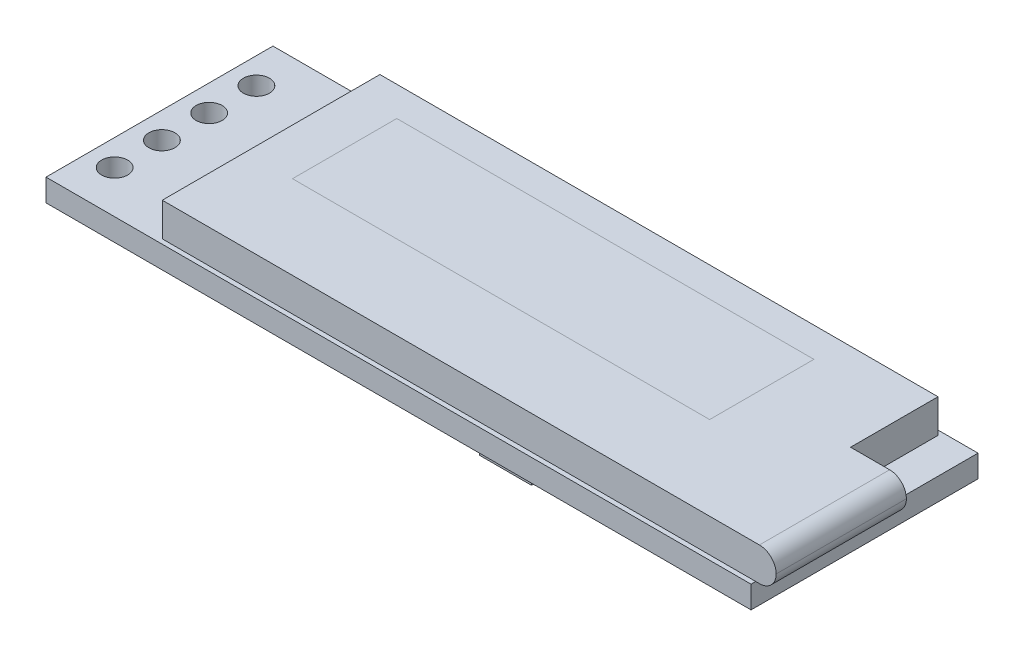
ISO-10303-21;
HEADER;
FILE_DESCRIPTION(('STEP AP214'),'2;1');
FILE_NAME('part.step','',(''),(''),'','','');
FILE_SCHEMA(('AUTOMOTIVE_DESIGN { 1 0 10303 214 1 1 1 1 }'));
ENDSEC;
DATA;
#1=APPLICATION_CONTEXT('core data for automotive mechanical design processes');
#2=APPLICATION_PROTOCOL_DEFINITION('international standard','automotive_design',2000,#1);
#3=PRODUCT_CONTEXT('',#1,'mechanical');
#4=PRODUCT('Part','Part','',(#3));
#5=PRODUCT_RELATED_PRODUCT_CATEGORY('part','',(#4));
#6=PRODUCT_DEFINITION_FORMATION('','',#4);
#7=PRODUCT_DEFINITION_CONTEXT('part definition',#1,'design');
#8=PRODUCT_DEFINITION('design','',#6,#7);
#9=PRODUCT_DEFINITION_SHAPE('','',#8);
#10=(LENGTH_UNIT() NAMED_UNIT(*) SI_UNIT(.MILLI.,.METRE.));
#11=(NAMED_UNIT(*) PLANE_ANGLE_UNIT() SI_UNIT($,.RADIAN.));
#12=(NAMED_UNIT(*) SI_UNIT($,.STERADIAN.) SOLID_ANGLE_UNIT());
#13=UNCERTAINTY_MEASURE_WITH_UNIT(LENGTH_MEASURE(1.E-05),#10,'distance_accuracy_value','');
#14=(GEOMETRIC_REPRESENTATION_CONTEXT(3) GLOBAL_UNCERTAINTY_ASSIGNED_CONTEXT((#13)) GLOBAL_UNIT_ASSIGNED_CONTEXT((#10,
#11,#12)) REPRESENTATION_CONTEXT('',''));
#15=CARTESIAN_POINT('',(0.,0.,0.));
#16=DIRECTION('',(0.,0.,1.));
#17=DIRECTION('',(1.,0.,0.));
#18=AXIS2_PLACEMENT_3D('',#15,#16,#17);
#19=CARTESIAN_POINT('',(0.,0.,0.));
#20=DIRECTION('',(0.,1.,0.));
#21=DIRECTION('',(0.,0.,1.));
#22=AXIS2_PLACEMENT_3D('',#19,#20,#21);
#23=PLANE('',#22);
#24=DIRECTION('',(0.,0.,1.));
#25=VECTOR('',#24,1.);
#26=CARTESIAN_POINT('',(-0.650000000000002,0.,4.7));
#27=LINE('',#26,#25);
#28=CARTESIAN_POINT('',(-0.65,0.,-3.3));
#29=VERTEX_POINT('',#28);
#30=CARTESIAN_POINT('',(-0.650000000000002,0.,4.7));
#31=VERTEX_POINT('',#30);
#32=EDGE_CURVE('E232',#29,#31,#27,.T.);
#33=ORIENTED_EDGE('',*,*,#32,.F.);
#34=DIRECTION('',(1.,0.,0.));
#35=VECTOR('',#34,1.);
#36=CARTESIAN_POINT('',(-3.45,0.,-3.3));
#37=LINE('',#36,#35);
#38=CARTESIAN_POINT('',(-3.45,0.,-3.3));
#39=VERTEX_POINT('',#38);
#40=EDGE_CURVE('E245',#39,#29,#37,.T.);
#41=ORIENTED_EDGE('',*,*,#40,.F.);
#42=DIRECTION('',(0.,0.,-1.));
#43=VECTOR('',#42,1.);
#44=CARTESIAN_POINT('',(-3.45,0.,4.7));
#45=LINE('',#44,#43);
#46=CARTESIAN_POINT('',(-3.45,0.,4.7));
#47=VERTEX_POINT('',#46);
#48=EDGE_CURVE('E254',#47,#39,#45,.T.);
#49=ORIENTED_EDGE('',*,*,#48,.F.);
#50=DIRECTION('',(-1.,0.,0.));
#51=VECTOR('',#50,1.);
#52=CARTESIAN_POINT('',(-3.45,0.,4.7));
#53=LINE('',#52,#51);
#54=EDGE_CURVE('E235',#31,#47,#53,.T.);
#55=ORIENTED_EDGE('',*,*,#54,.F.);
#56=EDGE_LOOP('',(#33,#41,#49,#55));
#57=FACE_BOUND('',#56,.T.);
#58=DIRECTION('',(0.,0.,-1.));
#59=VECTOR('',#58,1.);
#60=CARTESIAN_POINT('',(18.95,0.,-6.1));
#61=LINE('',#60,#59);
#62=CARTESIAN_POINT('',(18.95,0.,6.1));
#63=VERTEX_POINT('',#62);
#64=CARTESIAN_POINT('',(18.95,0.,-6.1));
#65=VERTEX_POINT('',#64);
#66=EDGE_CURVE('E368',#63,#65,#61,.T.);
#67=ORIENTED_EDGE('',*,*,#66,.F.);
#68=DIRECTION('',(1.,0.,0.));
#69=VECTOR('',#68,1.);
#70=CARTESIAN_POINT('',(-18.95,0.,6.1));
#71=LINE('',#70,#69);
#72=CARTESIAN_POINT('',(-18.95,0.,6.1));
#73=VERTEX_POINT('',#72);
#74=EDGE_CURVE('E387',#73,#63,#71,.T.);
#75=ORIENTED_EDGE('',*,*,#74,.F.);
#76=DIRECTION('',(0.,0.,1.));
#77=VECTOR('',#76,1.);
#78=CARTESIAN_POINT('',(-18.95,0.,-6.1));
#79=LINE('',#78,#77);
#80=CARTESIAN_POINT('',(-18.95,0.,-6.1));
#81=VERTEX_POINT('',#80);
#82=EDGE_CURVE('E385',#81,#73,#79,.T.);
#83=ORIENTED_EDGE('',*,*,#82,.F.);
#84=DIRECTION('',(-1.,0.,0.));
#85=VECTOR('',#84,1.);
#86=CARTESIAN_POINT('',(-18.95,0.,-6.1));
#87=LINE('',#86,#85);
#88=EDGE_CURVE('E383',#65,#81,#87,.T.);
#89=ORIENTED_EDGE('',*,*,#88,.F.);
#90=EDGE_LOOP('',(#67,#75,#83,#89));
#91=FACE_BOUND('',#90,.T.);
#92=CARTESIAN_POINT('',(-17.5499999999999,0.,3.81));
#93=DIRECTION('',(0.,1.,0.));
#94=DIRECTION('',(0.,0.,1.));
#95=AXIS2_PLACEMENT_3D('',#92,#93,#94);
#96=CIRCLE('',#95,0.699999999999998);
#97=CARTESIAN_POINT('',(-17.5499999999999,0.,4.51));
#98=VERTEX_POINT('',#97);
#99=EDGE_CURVE('E323',#98,#98,#96,.T.);
#100=ORIENTED_EDGE('',*,*,#99,.T.);
#101=EDGE_LOOP('',(#100));
#102=FACE_BOUND('',#101,.T.);
#103=CARTESIAN_POINT('',(-17.55,0.,1.27));
#104=DIRECTION('',(0.,1.,0.));
#105=DIRECTION('',(0.,0.,1.));
#106=AXIS2_PLACEMENT_3D('',#103,#104,#105);
#107=CIRCLE('',#106,0.699999999999998);
#108=CARTESIAN_POINT('',(-17.55,0.,1.97));
#109=VERTEX_POINT('',#108);
#110=EDGE_CURVE('E317',#109,#109,#107,.T.);
#111=ORIENTED_EDGE('',*,*,#110,.T.);
#112=EDGE_LOOP('',(#111));
#113=FACE_BOUND('',#112,.T.);
#114=CARTESIAN_POINT('',(-17.55,0.,-1.27));
#115=DIRECTION('',(0.,1.,0.));
#116=DIRECTION('',(0.,0.,1.));
#117=AXIS2_PLACEMENT_3D('',#114,#115,#116);
#118=CIRCLE('',#117,0.699999999999998);
#119=CARTESIAN_POINT('',(-17.55,0.,-0.570000000000002));
#120=VERTEX_POINT('',#119);
#121=EDGE_CURVE('E311',#120,#120,#118,.T.);
#122=ORIENTED_EDGE('',*,*,#121,.T.);
#123=EDGE_LOOP('',(#122));
#124=FACE_BOUND('',#123,.T.);
#125=CARTESIAN_POINT('',(-17.55,0.,-3.81));
#126=DIRECTION('',(0.,1.,0.));
#127=DIRECTION('',(0.,0.,1.));
#128=AXIS2_PLACEMENT_3D('',#125,#126,#127);
#129=CIRCLE('',#128,0.699999999999998);
#130=CARTESIAN_POINT('',(-17.55,0.,-3.11));
#131=VERTEX_POINT('',#130);
#132=EDGE_CURVE('E304',#131,#131,#129,.T.);
#133=ORIENTED_EDGE('',*,*,#132,.T.);
#134=EDGE_LOOP('',(#133));
#135=FACE_BOUND('',#134,.T.);
#136=DIRECTION('',(0.,0.,1.));
#137=VECTOR('',#136,1.);
#138=CARTESIAN_POINT('',(6.44999999999999,0.,5.4));
#139=LINE('',#138,#137);
#140=CARTESIAN_POINT('',(6.44999999999999,0.,-4.7));
#141=VERTEX_POINT('',#140);
#142=CARTESIAN_POINT('',(6.44999999999999,0.,5.4));
#143=VERTEX_POINT('',#142);
#144=EDGE_CURVE('E270',#141,#143,#139,.T.);
#145=ORIENTED_EDGE('',*,*,#144,.F.);
#146=DIRECTION('',(1.,0.,0.));
#147=VECTOR('',#146,1.);
#148=CARTESIAN_POINT('',(3.65,0.,-4.7));
#149=LINE('',#148,#147);
#150=CARTESIAN_POINT('',(3.65,0.,-4.7));
#151=VERTEX_POINT('',#150);
#152=EDGE_CURVE('E275',#151,#141,#149,.T.);
#153=ORIENTED_EDGE('',*,*,#152,.F.);
#154=DIRECTION('',(0.,0.,-1.));
#155=VECTOR('',#154,1.);
#156=CARTESIAN_POINT('',(3.64999999999999,0.,5.4));
#157=LINE('',#156,#155);
#158=CARTESIAN_POINT('',(3.64999999999999,0.,5.4));
#159=VERTEX_POINT('',#158);
#160=EDGE_CURVE('E287',#159,#151,#157,.T.);
#161=ORIENTED_EDGE('',*,*,#160,.F.);
#162=DIRECTION('',(-1.,0.,0.));
#163=VECTOR('',#162,1.);
#164=CARTESIAN_POINT('',(3.64999999999999,0.,5.4));
#165=LINE('',#164,#163);
#166=EDGE_CURVE('E284',#143,#159,#165,.T.);
#167=ORIENTED_EDGE('',*,*,#166,.F.);
#168=EDGE_LOOP('',(#145,#153,#161,#167));
#169=FACE_BOUND('',#168,.T.);
#170=DIRECTION('',(0.,0.,1.));
#171=VECTOR('',#170,1.);
#172=CARTESIAN_POINT('',(-7.55,0.,4.3));
#173=LINE('',#172,#171);
#174=CARTESIAN_POINT('',(-7.55,0.,-3.1));
#175=VERTEX_POINT('',#174);
#176=CARTESIAN_POINT('',(-7.55,0.,4.3));
#177=VERTEX_POINT('',#176);
#178=EDGE_CURVE('E231',#175,#177,#173,.T.);
#179=ORIENTED_EDGE('',*,*,#178,.F.);
#180=DIRECTION('',(1.,0.,0.));
#181=VECTOR('',#180,1.);
#182=CARTESIAN_POINT('',(-11.55,0.,-3.1));
#183=LINE('',#182,#181);
#184=CARTESIAN_POINT('',(-11.55,0.,-3.1));
#185=VERTEX_POINT('',#184);
#186=EDGE_CURVE('E228',#185,#175,#183,.T.);
#187=ORIENTED_EDGE('',*,*,#186,.F.);
#188=DIRECTION('',(0.,0.,-1.));
#189=VECTOR('',#188,1.);
#190=CARTESIAN_POINT('',(-11.55,0.,4.3));
#191=LINE('',#190,#189);
#192=CARTESIAN_POINT('',(-11.55,0.,4.3));
#193=VERTEX_POINT('',#192);
#194=EDGE_CURVE('E59',#193,#185,#191,.T.);
#195=ORIENTED_EDGE('',*,*,#194,.F.);
#196=DIRECTION('',(-1.,0.,0.));
#197=VECTOR('',#196,1.);
#198=CARTESIAN_POINT('',(-11.55,0.,4.3));
#199=LINE('',#198,#197);
#200=EDGE_CURVE('E54',#177,#193,#199,.T.);
#201=ORIENTED_EDGE('',*,*,#200,.F.);
#202=EDGE_LOOP('',(#179,#187,#195,#201));
#203=FACE_BOUND('',#202,.T.);
#204=ADVANCED_FACE('F38',(#57,#91,#102,#113,#124,#135,#169,#203),#23,.F.);
#205=CARTESIAN_POINT('',(0.,3.,0.));
#206=DIRECTION('',(0.,1.,0.));
#207=DIRECTION('',(0.,0.,1.));
#208=AXIS2_PLACEMENT_3D('',#205,#206,#207);
#209=PLANE('',#208);
#210=DIRECTION('',(1.,0.,0.));
#211=VECTOR('',#210,1.);
#212=CARTESIAN_POINT('',(17.05,3.,5.85));
#213=LINE('',#212,#211);
#214=CARTESIAN_POINT('',(-12.95,3.,5.85));
#215=VERTEX_POINT('',#214);
#216=CARTESIAN_POINT('',(19.15,3.,5.85));
#217=VERTEX_POINT('',#216);
#218=EDGE_CURVE('E328',#215,#217,#213,.T.);
#219=ORIENTED_EDGE('',*,*,#218,.T.);
#220=DIRECTION('',(0.,0.,-1.));
#221=VECTOR('',#220,1.);
#222=CARTESIAN_POINT('',(19.15,3.,-1.15));
#223=LINE('',#222,#221);
#224=CARTESIAN_POINT('',(19.15,3.,-1.15));
#225=VERTEX_POINT('',#224);
#226=EDGE_CURVE('E411',#217,#225,#223,.T.);
#227=ORIENTED_EDGE('',*,*,#226,.T.);
#228=DIRECTION('',(-1.,0.,0.));
#229=VECTOR('',#228,1.);
#230=CARTESIAN_POINT('',(17.05,3.,-1.15));
#231=LINE('',#230,#229);
#232=CARTESIAN_POINT('',(17.05,3.,-1.15));
#233=VERTEX_POINT('',#232);
#234=EDGE_CURVE('E331',#225,#233,#231,.T.);
#235=ORIENTED_EDGE('',*,*,#234,.T.);
#236=DIRECTION('',(0.,0.,-1.));
#237=VECTOR('',#236,1.);
#238=CARTESIAN_POINT('',(17.05,3.,-5.85));
#239=LINE('',#238,#237);
#240=CARTESIAN_POINT('',(17.05,3.,-5.85));
#241=VERTEX_POINT('',#240);
#242=EDGE_CURVE('E334',#233,#241,#239,.T.);
#243=ORIENTED_EDGE('',*,*,#242,.T.);
#244=DIRECTION('',(-1.,0.,0.));
#245=VECTOR('',#244,1.);
#246=CARTESIAN_POINT('',(-12.95,3.,-5.85));
#247=LINE('',#246,#245);
#248=CARTESIAN_POINT('',(-12.95,3.,-5.85));
#249=VERTEX_POINT('',#248);
#250=EDGE_CURVE('E336',#241,#249,#247,.T.);
#251=ORIENTED_EDGE('',*,*,#250,.T.);
#252=DIRECTION('',(0.,0.,1.));
#253=VECTOR('',#252,1.);
#254=CARTESIAN_POINT('',(-12.95,3.,-5.85));
#255=LINE('',#254,#253);
#256=EDGE_CURVE('E338',#249,#215,#255,.T.);
#257=ORIENTED_EDGE('',*,*,#256,.T.);
#258=EDGE_LOOP('',(#219,#227,#235,#243,#251,#257));
#259=FACE_BOUND('',#258,.T.);
#260=DIRECTION('',(1.,0.,0.));
#261=VECTOR('',#260,1.);
#262=CARTESIAN_POINT('',(0.,3.,-4.2559684370898));
#263=LINE('',#262,#261);
#264=CARTESIAN_POINT('',(-10.45,3.,-4.2559684370898));
#265=VERTEX_POINT('',#264);
#266=CARTESIAN_POINT('',(11.9738737483592,3.,-4.2559684370898));
#267=VERTEX_POINT('',#266);
#268=EDGE_CURVE('E47',#265,#267,#263,.T.);
#269=ORIENTED_EDGE('',*,*,#268,.T.);
#270=DIRECTION('',(0.,0.,1.));
#271=VECTOR('',#270,1.);
#272=CARTESIAN_POINT('',(11.9738737483592,3.,0.));
#273=LINE('',#272,#271);
#274=CARTESIAN_POINT('',(11.9738737483592,3.,1.35));
#275=VERTEX_POINT('',#274);
#276=EDGE_CURVE('E11',#267,#275,#273,.T.);
#277=ORIENTED_EDGE('',*,*,#276,.T.);
#278=DIRECTION('',(-1.,0.,0.));
#279=VECTOR('',#278,1.);
#280=CARTESIAN_POINT('',(0.,3.,1.35));
#281=LINE('',#280,#279);
#282=CARTESIAN_POINT('',(-10.45,3.,1.35));
#283=VERTEX_POINT('',#282);
#284=EDGE_CURVE('E413',#275,#283,#281,.T.);
#285=ORIENTED_EDGE('',*,*,#284,.T.);
#286=DIRECTION('',(0.,0.,-1.));
#287=VECTOR('',#286,1.);
#288=CARTESIAN_POINT('',(-10.45,3.,0.));
#289=LINE('',#288,#287);
#290=EDGE_CURVE('E419',#283,#265,#289,.T.);
#291=ORIENTED_EDGE('',*,*,#290,.T.);
#292=EDGE_LOOP('',(#269,#277,#285,#291));
#293=FACE_BOUND('',#292,.T.);
#294=ADVANCED_FACE('F427',(#259,#293),#209,.T.);
#295=CARTESIAN_POINT('',(18.95,1.2,-6.1));
#296=DIRECTION('',(-1.,0.,0.));
#297=DIRECTION('',(0.,0.,1.));
#298=AXIS2_PLACEMENT_3D('',#295,#296,#297);
#299=PLANE('',#298);
#300=ORIENTED_EDGE('',*,*,#66,.T.);
#301=DIRECTION('',(0.,-1.,0.));
#302=VECTOR('',#301,1.);
#303=CARTESIAN_POINT('',(18.95,1.2,-6.1));
#304=LINE('',#303,#302);
#305=CARTESIAN_POINT('',(18.95,1.2,-6.1));
#306=VERTEX_POINT('',#305);
#307=EDGE_CURVE('E397',#306,#65,#304,.T.);
#308=ORIENTED_EDGE('',*,*,#307,.F.);
#309=DIRECTION('',(0.,0.,-1.));
#310=VECTOR('',#309,1.);
#311=CARTESIAN_POINT('',(18.95,1.2,-6.1));
#312=LINE('',#311,#310);
#313=CARTESIAN_POINT('',(18.95,1.2,-1.15));
#314=VERTEX_POINT('',#313);
#315=EDGE_CURVE('E374',#314,#306,#312,.T.);
#316=ORIENTED_EDGE('',*,*,#315,.F.);
#317=CARTESIAN_POINT('',(18.95,1.2,5.85));
#318=VERTEX_POINT('',#317);
#319=EDGE_CURVE('E373',#318,#314,#312,.T.);
#320=ORIENTED_EDGE('',*,*,#319,.F.);
#321=CARTESIAN_POINT('',(18.95,1.2,6.1));
#322=VERTEX_POINT('',#321);
#323=EDGE_CURVE('E369',#322,#318,#312,.T.);
#324=ORIENTED_EDGE('',*,*,#323,.F.);
#325=DIRECTION('',(0.,-1.,0.));
#326=VECTOR('',#325,1.);
#327=CARTESIAN_POINT('',(18.95,1.2,6.1));
#328=LINE('',#327,#326);
#329=EDGE_CURVE('E380',#322,#63,#328,.T.);
#330=ORIENTED_EDGE('',*,*,#329,.T.);
#331=EDGE_LOOP('',(#300,#308,#316,#320,#324,#330));
#332=FACE_BOUND('',#331,.T.);
#333=ADVANCED_FACE('F446',(#332),#299,.F.);
#334=CARTESIAN_POINT('',(-18.95,1.2,-6.1));
#335=DIRECTION('',(0.,0.,1.));
#336=DIRECTION('',(1.,0.,0.));
#337=AXIS2_PLACEMENT_3D('',#334,#335,#336);
#338=PLANE('',#337);
#339=ORIENTED_EDGE('',*,*,#88,.T.);
#340=DIRECTION('',(0.,-1.,0.));
#341=VECTOR('',#340,1.);
#342=CARTESIAN_POINT('',(-18.95,1.2,-6.1));
#343=LINE('',#342,#341);
#344=CARTESIAN_POINT('',(-18.95,1.2,-6.1));
#345=VERTEX_POINT('',#344);
#346=EDGE_CURVE('E394',#345,#81,#343,.T.);
#347=ORIENTED_EDGE('',*,*,#346,.F.);
#348=DIRECTION('',(-1.,0.,0.));
#349=VECTOR('',#348,1.);
#350=CARTESIAN_POINT('',(-18.95,1.2,-6.1));
#351=LINE('',#350,#349);
#352=EDGE_CURVE('E372',#306,#345,#351,.T.);
#353=ORIENTED_EDGE('',*,*,#352,.F.);
#354=ORIENTED_EDGE('',*,*,#307,.T.);
#355=EDGE_LOOP('',(#339,#347,#353,#354));
#356=FACE_BOUND('',#355,.T.);
#357=ADVANCED_FACE('F465',(#356),#338,.F.);
#358=CARTESIAN_POINT('',(-18.95,1.2,-6.1));
#359=DIRECTION('',(1.,0.,0.));
#360=DIRECTION('',(0.,0.,-1.));
#361=AXIS2_PLACEMENT_3D('',#358,#359,#360);
#362=PLANE('',#361);
#363=ORIENTED_EDGE('',*,*,#82,.T.);
#364=DIRECTION('',(0.,-1.,0.));
#365=VECTOR('',#364,1.);
#366=CARTESIAN_POINT('',(-18.95,1.2,6.1));
#367=LINE('',#366,#365);
#368=CARTESIAN_POINT('',(-18.95,1.2,6.1));
#369=VERTEX_POINT('',#368);
#370=EDGE_CURVE('E391',#369,#73,#367,.T.);
#371=ORIENTED_EDGE('',*,*,#370,.F.);
#372=DIRECTION('',(0.,0.,1.));
#373=VECTOR('',#372,1.);
#374=CARTESIAN_POINT('',(-18.95,1.2,-6.1));
#375=LINE('',#374,#373);
#376=EDGE_CURVE('E376',#345,#369,#375,.T.);
#377=ORIENTED_EDGE('',*,*,#376,.F.);
#378=ORIENTED_EDGE('',*,*,#346,.T.);
#379=EDGE_LOOP('',(#363,#371,#377,#378));
#380=FACE_BOUND('',#379,.T.);
#381=ADVANCED_FACE('F461',(#380),#362,.F.);
#382=CARTESIAN_POINT('',(-18.95,1.2,6.1));
#383=DIRECTION('',(0.,0.,-1.));
#384=DIRECTION('',(-1.,0.,0.));
#385=AXIS2_PLACEMENT_3D('',#382,#383,#384);
#386=PLANE('',#385);
#387=ORIENTED_EDGE('',*,*,#74,.T.);
#388=ORIENTED_EDGE('',*,*,#329,.F.);
#389=DIRECTION('',(1.,0.,0.));
#390=VECTOR('',#389,1.);
#391=CARTESIAN_POINT('',(-18.95,1.2,6.1));
#392=LINE('',#391,#390);
#393=EDGE_CURVE('E378',#369,#322,#392,.T.);
#394=ORIENTED_EDGE('',*,*,#393,.F.);
#395=ORIENTED_EDGE('',*,*,#370,.T.);
#396=EDGE_LOOP('',(#387,#388,#394,#395));
#397=FACE_BOUND('',#396,.T.);
#398=ADVANCED_FACE('F458',(#397),#386,.F.);
#399=CARTESIAN_POINT('',(0.,1.2,0.));
#400=DIRECTION('',(0.,1.,0.));
#401=DIRECTION('',(0.,0.,1.));
#402=AXIS2_PLACEMENT_3D('',#399,#400,#401);
#403=PLANE('',#402);
#404=CARTESIAN_POINT('',(-17.55,1.2,-3.81));
#405=DIRECTION('',(0.,1.,0.));
#406=DIRECTION('',(0.,0.,1.));
#407=AXIS2_PLACEMENT_3D('',#404,#405,#406);
#408=CIRCLE('',#407,0.699999999999998);
#409=CARTESIAN_POINT('',(-17.55,1.2,-3.11));
#410=VERTEX_POINT('',#409);
#411=EDGE_CURVE('E308',#410,#410,#408,.T.);
#412=ORIENTED_EDGE('',*,*,#411,.F.);
#413=EDGE_LOOP('',(#412));
#414=FACE_BOUND('',#413,.T.);
#415=CARTESIAN_POINT('',(-17.55,1.2,-1.27));
#416=DIRECTION('',(0.,1.,0.));
#417=DIRECTION('',(0.,0.,1.));
#418=AXIS2_PLACEMENT_3D('',#415,#416,#417);
#419=CIRCLE('',#418,0.699999999999998);
#420=CARTESIAN_POINT('',(-17.55,1.2,-0.570000000000002));
#421=VERTEX_POINT('',#420);
#422=EDGE_CURVE('E314',#421,#421,#419,.T.);
#423=ORIENTED_EDGE('',*,*,#422,.F.);
#424=EDGE_LOOP('',(#423));
#425=FACE_BOUND('',#424,.T.);
#426=CARTESIAN_POINT('',(-17.55,1.2,1.27));
#427=DIRECTION('',(0.,1.,0.));
#428=DIRECTION('',(0.,0.,1.));
#429=AXIS2_PLACEMENT_3D('',#426,#427,#428);
#430=CIRCLE('',#429,0.699999999999998);
#431=CARTESIAN_POINT('',(-17.55,1.2,1.97));
#432=VERTEX_POINT('',#431);
#433=EDGE_CURVE('E320',#432,#432,#430,.T.);
#434=ORIENTED_EDGE('',*,*,#433,.F.);
#435=EDGE_LOOP('',(#434));
#436=FACE_BOUND('',#435,.T.);
#437=CARTESIAN_POINT('',(-17.5499999999999,1.2,3.81));
#438=DIRECTION('',(0.,1.,0.));
#439=DIRECTION('',(0.,0.,1.));
#440=AXIS2_PLACEMENT_3D('',#437,#438,#439);
#441=CIRCLE('',#440,0.699999999999998);
#442=CARTESIAN_POINT('',(-17.5499999999999,1.2,4.51));
#443=VERTEX_POINT('',#442);
#444=EDGE_CURVE('E303',#443,#443,#441,.T.);
#445=ORIENTED_EDGE('',*,*,#444,.F.);
#446=EDGE_LOOP('',(#445));
#447=FACE_BOUND('',#446,.T.);
#448=DIRECTION('',(1.,0.,0.));
#449=VECTOR('',#448,1.);
#450=CARTESIAN_POINT('',(-12.95,1.2,5.85));
#451=LINE('',#450,#449);
#452=CARTESIAN_POINT('',(-12.95,1.2,5.85));
#453=VERTEX_POINT('',#452);
#454=EDGE_CURVE('E332',#453,#318,#451,.T.);
#455=ORIENTED_EDGE('',*,*,#454,.F.);
#456=DIRECTION('',(0.,0.,1.));
#457=VECTOR('',#456,1.);
#458=CARTESIAN_POINT('',(-12.95,1.2,-5.85));
#459=LINE('',#458,#457);
#460=CARTESIAN_POINT('',(-12.95,1.2,-5.85));
#461=VERTEX_POINT('',#460);
#462=EDGE_CURVE('E351',#461,#453,#459,.T.);
#463=ORIENTED_EDGE('',*,*,#462,.F.);
#464=DIRECTION('',(-1.,0.,0.));
#465=VECTOR('',#464,1.);
#466=CARTESIAN_POINT('',(-12.95,1.2,-5.85));
#467=LINE('',#466,#465);
#468=CARTESIAN_POINT('',(17.05,1.2,-5.85));
#469=VERTEX_POINT('',#468);
#470=EDGE_CURVE('E348',#469,#461,#467,.T.);
#471=ORIENTED_EDGE('',*,*,#470,.F.);
#472=DIRECTION('',(0.,0.,-1.));
#473=VECTOR('',#472,1.);
#474=CARTESIAN_POINT('',(17.05,1.2,-5.85));
#475=LINE('',#474,#473);
#476=CARTESIAN_POINT('',(17.05,1.2,-1.15));
#477=VERTEX_POINT('',#476);
#478=EDGE_CURVE('E344',#477,#469,#475,.T.);
#479=ORIENTED_EDGE('',*,*,#478,.F.);
#480=DIRECTION('',(-1.,0.,0.));
#481=VECTOR('',#480,1.);
#482=CARTESIAN_POINT('',(17.05,1.2,-1.15));
#483=LINE('',#482,#481);
#484=EDGE_CURVE('E345',#314,#477,#483,.T.);
#485=ORIENTED_EDGE('',*,*,#484,.F.);
#486=ORIENTED_EDGE('',*,*,#315,.T.);
#487=ORIENTED_EDGE('',*,*,#352,.T.);
#488=ORIENTED_EDGE('',*,*,#376,.T.);
#489=ORIENTED_EDGE('',*,*,#393,.T.);
#490=ORIENTED_EDGE('',*,*,#323,.T.);
#491=EDGE_LOOP('',(#455,#463,#471,#479,#485,#486,#487,#488,#489,#490));
#492=FACE_BOUND('',#491,.T.);
#493=ADVANCED_FACE('F456',(#414,#425,#436,#447,#492),#403,.T.);
#494=CARTESIAN_POINT('',(0.,1.2,0.));
#495=DIRECTION('',(0.,1.,0.));
#496=DIRECTION('',(0.,0.,1.));
#497=AXIS2_PLACEMENT_3D('',#494,#495,#496);
#498=PLANE('',#497);
#499=CARTESIAN_POINT('',(19.15,1.2,-1.15));
#500=VERTEX_POINT('',#499);
#501=EDGE_CURVE('E342',#500,#314,#483,.T.);
#502=ORIENTED_EDGE('',*,*,#501,.F.);
#503=DIRECTION('',(0.,0.,-1.));
#504=VECTOR('',#503,1.);
#505=CARTESIAN_POINT('',(19.15,1.2,0.));
#506=LINE('',#505,#504);
#507=CARTESIAN_POINT('',(19.15,1.2,5.85));
#508=VERTEX_POINT('',#507);
#509=EDGE_CURVE('E404',#500,#508,#506,.F.);
#510=ORIENTED_EDGE('',*,*,#509,.T.);
#511=EDGE_CURVE('E354',#318,#508,#451,.T.);
#512=ORIENTED_EDGE('',*,*,#511,.F.);
#513=ORIENTED_EDGE('',*,*,#319,.T.);
#514=EDGE_LOOP('',(#502,#510,#512,#513));
#515=FACE_BOUND('',#514,.T.);
#516=ADVANCED_FACE('F488',(#515),#498,.F.);
#517=CARTESIAN_POINT('',(17.05,3.,-1.15));
#518=DIRECTION('',(0.,0.,1.));
#519=DIRECTION('',(1.,0.,0.));
#520=AXIS2_PLACEMENT_3D('',#517,#518,#519);
#521=PLANE('',#520);
#522=CARTESIAN_POINT('',(19.15,2.1,-1.15));
#523=DIRECTION('',(0.,0.,1.));
#524=DIRECTION('',(1.,0.,0.));
#525=AXIS2_PLACEMENT_3D('',#522,#523,#524);
#526=CIRCLE('',#525,0.9);
#527=CARTESIAN_POINT('',(20.05,2.1,-1.15));
#528=VERTEX_POINT('',#527);
#529=EDGE_CURVE('E400',#225,#528,#526,.F.);
#530=ORIENTED_EDGE('',*,*,#529,.T.);
#531=CARTESIAN_POINT('',(19.15,2.1,-1.15));
#532=DIRECTION('',(0.,0.,1.));
#533=DIRECTION('',(1.,0.,0.));
#534=AXIS2_PLACEMENT_3D('',#531,#532,#533);
#535=CIRCLE('',#534,0.9);
#536=EDGE_CURVE('E402',#528,#500,#535,.F.);
#537=ORIENTED_EDGE('',*,*,#536,.T.);
#538=ORIENTED_EDGE('',*,*,#501,.T.);
#539=ORIENTED_EDGE('',*,*,#484,.T.);
#540=DIRECTION('',(0.,-1.,0.));
#541=VECTOR('',#540,1.);
#542=CARTESIAN_POINT('',(17.05,3.,-1.15));
#543=LINE('',#542,#541);
#544=EDGE_CURVE('E365',#233,#477,#543,.T.);
#545=ORIENTED_EDGE('',*,*,#544,.F.);
#546=ORIENTED_EDGE('',*,*,#234,.F.);
#547=EDGE_LOOP('',(#530,#537,#538,#539,#545,#546));
#548=FACE_BOUND('',#547,.T.);
#549=ADVANCED_FACE('F508',(#548),#521,.F.);
#550=CARTESIAN_POINT('',(17.05,3.,-5.85));
#551=DIRECTION('',(-1.,0.,0.));
#552=DIRECTION('',(0.,0.,1.));
#553=AXIS2_PLACEMENT_3D('',#550,#551,#552);
#554=PLANE('',#553);
#555=ORIENTED_EDGE('',*,*,#478,.T.);
#556=DIRECTION('',(0.,-1.,0.));
#557=VECTOR('',#556,1.);
#558=CARTESIAN_POINT('',(17.05,3.,-5.85));
#559=LINE('',#558,#557);
#560=EDGE_CURVE('E362',#241,#469,#559,.T.);
#561=ORIENTED_EDGE('',*,*,#560,.F.);
#562=ORIENTED_EDGE('',*,*,#242,.F.);
#563=ORIENTED_EDGE('',*,*,#544,.T.);
#564=EDGE_LOOP('',(#555,#561,#562,#563));
#565=FACE_BOUND('',#564,.T.);
#566=ADVANCED_FACE('F503',(#565),#554,.F.);
#567=CARTESIAN_POINT('',(-12.95,3.,-5.85));
#568=DIRECTION('',(0.,0.,1.));
#569=DIRECTION('',(1.,0.,0.));
#570=AXIS2_PLACEMENT_3D('',#567,#568,#569);
#571=PLANE('',#570);
#572=ORIENTED_EDGE('',*,*,#470,.T.);
#573=DIRECTION('',(0.,-1.,0.));
#574=VECTOR('',#573,1.);
#575=CARTESIAN_POINT('',(-12.95,3.,-5.85));
#576=LINE('',#575,#574);
#577=EDGE_CURVE('E359',#249,#461,#576,.T.);
#578=ORIENTED_EDGE('',*,*,#577,.F.);
#579=ORIENTED_EDGE('',*,*,#250,.F.);
#580=ORIENTED_EDGE('',*,*,#560,.T.);
#581=EDGE_LOOP('',(#572,#578,#579,#580));
#582=FACE_BOUND('',#581,.T.);
#583=ADVANCED_FACE('F498',(#582),#571,.F.);
#584=CARTESIAN_POINT('',(-12.95,3.,-5.85));
#585=DIRECTION('',(1.,0.,0.));
#586=DIRECTION('',(0.,0.,-1.));
#587=AXIS2_PLACEMENT_3D('',#584,#585,#586);
#588=PLANE('',#587);
#589=ORIENTED_EDGE('',*,*,#462,.T.);
#590=DIRECTION('',(0.,-1.,0.));
#591=VECTOR('',#590,1.);
#592=CARTESIAN_POINT('',(-12.95,3.,5.85));
#593=LINE('',#592,#591);
#594=EDGE_CURVE('E341',#215,#453,#593,.T.);
#595=ORIENTED_EDGE('',*,*,#594,.F.);
#596=ORIENTED_EDGE('',*,*,#256,.F.);
#597=ORIENTED_EDGE('',*,*,#577,.T.);
#598=EDGE_LOOP('',(#589,#595,#596,#597));
#599=FACE_BOUND('',#598,.T.);
#600=ADVANCED_FACE('F440',(#599),#588,.F.);
#601=CARTESIAN_POINT('',(-12.95,3.,5.85));
#602=DIRECTION('',(0.,0.,-1.));
#603=DIRECTION('',(-1.,0.,0.));
#604=AXIS2_PLACEMENT_3D('',#601,#602,#603);
#605=PLANE('',#604);
#606=ORIENTED_EDGE('',*,*,#511,.T.);
#607=CARTESIAN_POINT('',(19.15,2.1,5.85));
#608=DIRECTION('',(0.,0.,-1.));
#609=DIRECTION('',(-1.,0.,0.));
#610=AXIS2_PLACEMENT_3D('',#607,#608,#609);
#611=CIRCLE('',#610,0.9);
#612=CARTESIAN_POINT('',(20.05,2.1,5.85));
#613=VERTEX_POINT('',#612);
#614=EDGE_CURVE('E409',#508,#613,#611,.F.);
#615=ORIENTED_EDGE('',*,*,#614,.T.);
#616=CARTESIAN_POINT('',(19.15,2.1,5.85));
#617=DIRECTION('',(0.,0.,-1.));
#618=DIRECTION('',(-1.,0.,0.));
#619=AXIS2_PLACEMENT_3D('',#616,#617,#618);
#620=CIRCLE('',#619,0.9);
#621=EDGE_CURVE('E407',#613,#217,#620,.F.);
#622=ORIENTED_EDGE('',*,*,#621,.T.);
#623=ORIENTED_EDGE('',*,*,#218,.F.);
#624=ORIENTED_EDGE('',*,*,#594,.T.);
#625=ORIENTED_EDGE('',*,*,#454,.T.);
#626=EDGE_LOOP('',(#606,#615,#622,#623,#624,#625));
#627=FACE_BOUND('',#626,.T.);
#628=ADVANCED_FACE('F432',(#627),#605,.F.);
#629=ORIENTED_EDGE('',*,*,#276,.F.);
#630=ORIENTED_EDGE('',*,*,#268,.F.);
#631=ORIENTED_EDGE('',*,*,#290,.F.);
#632=ORIENTED_EDGE('',*,*,#284,.F.);
#633=EDGE_LOOP('',(#629,#630,#631,#632));
#634=FACE_BOUND('',#633,.T.);
#635=ADVANCED_FACE('F430',(#634),#209,.T.);
#636=CARTESIAN_POINT('',(19.15,2.1,0.));
#637=DIRECTION('',(0.,0.,1.));
#638=DIRECTION('',(1.,0.,0.));
#639=AXIS2_PLACEMENT_3D('',#636,#637,#638);
#640=CYLINDRICAL_SURFACE('',#639,0.9);
#641=ORIENTED_EDGE('',*,*,#226,.F.);
#642=ORIENTED_EDGE('',*,*,#621,.F.);
#643=DIRECTION('',(0.,0.,-1.));
#644=VECTOR('',#643,1.);
#645=CARTESIAN_POINT('',(20.05,2.1,5.85));
#646=LINE('',#645,#644);
#647=EDGE_CURVE('E307',#528,#613,#646,.F.);
#648=ORIENTED_EDGE('',*,*,#647,.F.);
#649=ORIENTED_EDGE('',*,*,#529,.F.);
#650=EDGE_LOOP('',(#641,#642,#648,#649));
#651=FACE_BOUND('',#650,.T.);
#652=ADVANCED_FACE('F40',(#651),#640,.T.);
#653=CARTESIAN_POINT('',(19.15,2.1,5.85));
#654=DIRECTION('',(0.,0.,-1.));
#655=DIRECTION('',(-1.,0.,0.));
#656=AXIS2_PLACEMENT_3D('',#653,#654,#655);
#657=CYLINDRICAL_SURFACE('',#656,0.9);
#658=ORIENTED_EDGE('',*,*,#614,.F.);
#659=ORIENTED_EDGE('',*,*,#509,.F.);
#660=ORIENTED_EDGE('',*,*,#536,.F.);
#661=ORIENTED_EDGE('',*,*,#647,.T.);
#662=EDGE_LOOP('',(#658,#659,#660,#661));
#663=FACE_BOUND('',#662,.T.);
#664=ADVANCED_FACE('F438',(#663),#657,.T.);
#665=CARTESIAN_POINT('',(-17.5499999999999,0.,3.81));
#666=DIRECTION('',(0.,1.,0.));
#667=DIRECTION('',(0.,0.,1.));
#668=AXIS2_PLACEMENT_3D('',#665,#666,#667);
#669=CYLINDRICAL_SURFACE('',#668,0.699999999999998);
#670=ORIENTED_EDGE('',*,*,#99,.F.);
#671=EDGE_LOOP('',(#670));
#672=FACE_BOUND('',#671,.T.);
#673=ORIENTED_EDGE('',*,*,#444,.T.);
#674=EDGE_LOOP('',(#673));
#675=FACE_BOUND('',#674,.T.);
#676=ADVANCED_FACE('F473',(#672,#675),#669,.F.);
#677=CARTESIAN_POINT('',(-17.55,0.,1.27));
#678=DIRECTION('',(0.,1.,0.));
#679=DIRECTION('',(0.,0.,1.));
#680=AXIS2_PLACEMENT_3D('',#677,#678,#679);
#681=CYLINDRICAL_SURFACE('',#680,0.699999999999998);
#682=ORIENTED_EDGE('',*,*,#110,.F.);
#683=EDGE_LOOP('',(#682));
#684=FACE_BOUND('',#683,.T.);
#685=ORIENTED_EDGE('',*,*,#433,.T.);
#686=EDGE_LOOP('',(#685));
#687=FACE_BOUND('',#686,.T.);
#688=ADVANCED_FACE('F478',(#684,#687),#681,.F.);
#689=CARTESIAN_POINT('',(-17.55,0.,-1.27));
#690=DIRECTION('',(0.,1.,0.));
#691=DIRECTION('',(0.,0.,1.));
#692=AXIS2_PLACEMENT_3D('',#689,#690,#691);
#693=CYLINDRICAL_SURFACE('',#692,0.699999999999998);
#694=ORIENTED_EDGE('',*,*,#121,.F.);
#695=EDGE_LOOP('',(#694));
#696=FACE_BOUND('',#695,.T.);
#697=ORIENTED_EDGE('',*,*,#422,.T.);
#698=EDGE_LOOP('',(#697));
#699=FACE_BOUND('',#698,.T.);
#700=ADVANCED_FACE('F600',(#696,#699),#693,.F.);
#701=CARTESIAN_POINT('',(-17.55,0.,-3.81));
#702=DIRECTION('',(0.,1.,0.));
#703=DIRECTION('',(0.,0.,1.));
#704=AXIS2_PLACEMENT_3D('',#701,#702,#703);
#705=CYLINDRICAL_SURFACE('',#704,0.699999999999998);
#706=ORIENTED_EDGE('',*,*,#132,.F.);
#707=EDGE_LOOP('',(#706));
#708=FACE_BOUND('',#707,.T.);
#709=ORIENTED_EDGE('',*,*,#411,.T.);
#710=EDGE_LOOP('',(#709));
#711=FACE_BOUND('',#710,.T.);
#712=ADVANCED_FACE('F596',(#708,#711),#705,.F.);
#713=CARTESIAN_POINT('',(6.44999999999999,-0.8,5.4));
#714=DIRECTION('',(-1.,0.,0.));
#715=DIRECTION('',(0.,0.,1.));
#716=AXIS2_PLACEMENT_3D('',#713,#714,#715);
#717=PLANE('',#716);
#718=ORIENTED_EDGE('',*,*,#144,.T.);
#719=DIRECTION('',(0.,1.,0.));
#720=VECTOR('',#719,1.);
#721=CARTESIAN_POINT('',(6.44999999999999,-0.8,5.4));
#722=LINE('',#721,#720);
#723=CARTESIAN_POINT('',(6.44999999999999,-0.8,5.4));
#724=VERTEX_POINT('',#723);
#725=EDGE_CURVE('E300',#724,#143,#722,.T.);
#726=ORIENTED_EDGE('',*,*,#725,.F.);
#727=DIRECTION('',(0.,0.,1.));
#728=VECTOR('',#727,1.);
#729=CARTESIAN_POINT('',(6.44999999999999,-0.8,5.4));
#730=LINE('',#729,#728);
#731=CARTESIAN_POINT('',(6.44999999999999,-0.8,-4.7));
#732=VERTEX_POINT('',#731);
#733=EDGE_CURVE('E271',#732,#724,#730,.T.);
#734=ORIENTED_EDGE('',*,*,#733,.F.);
#735=DIRECTION('',(0.,1.,0.));
#736=VECTOR('',#735,1.);
#737=CARTESIAN_POINT('',(6.44999999999999,-0.8,-4.7));
#738=LINE('',#737,#736);
#739=EDGE_CURVE('E281',#732,#141,#738,.T.);
#740=ORIENTED_EDGE('',*,*,#739,.T.);
#741=EDGE_LOOP('',(#718,#726,#734,#740));
#742=FACE_BOUND('',#741,.T.);
#743=ADVANCED_FACE('F592',(#742),#717,.F.);
#744=CARTESIAN_POINT('',(3.64999999999999,-0.8,5.4));
#745=DIRECTION('',(0.,0.,-1.));
#746=DIRECTION('',(-1.,0.,0.));
#747=AXIS2_PLACEMENT_3D('',#744,#745,#746);
#748=PLANE('',#747);
#749=ORIENTED_EDGE('',*,*,#166,.T.);
#750=DIRECTION('',(0.,1.,0.));
#751=VECTOR('',#750,1.);
#752=CARTESIAN_POINT('',(3.64999999999999,-0.8,5.4));
#753=LINE('',#752,#751);
#754=CARTESIAN_POINT('',(3.64999999999999,-0.8,5.4));
#755=VERTEX_POINT('',#754);
#756=EDGE_CURVE('E297',#755,#159,#753,.T.);
#757=ORIENTED_EDGE('',*,*,#756,.F.);
#758=DIRECTION('',(-1.,0.,0.));
#759=VECTOR('',#758,1.);
#760=CARTESIAN_POINT('',(3.64999999999999,-0.8,5.4));
#761=LINE('',#760,#759);
#762=EDGE_CURVE('E274',#724,#755,#761,.T.);
#763=ORIENTED_EDGE('',*,*,#762,.F.);
#764=ORIENTED_EDGE('',*,*,#725,.T.);
#765=EDGE_LOOP('',(#749,#757,#763,#764));
#766=FACE_BOUND('',#765,.T.);
#767=ADVANCED_FACE('F588',(#766),#748,.F.);
#768=CARTESIAN_POINT('',(3.64999999999999,-0.8,5.4));
#769=DIRECTION('',(1.,0.,0.));
#770=DIRECTION('',(0.,0.,-1.));
#771=AXIS2_PLACEMENT_3D('',#768,#769,#770);
#772=PLANE('',#771);
#773=ORIENTED_EDGE('',*,*,#160,.T.);
#774=DIRECTION('',(0.,1.,0.));
#775=VECTOR('',#774,1.);
#776=CARTESIAN_POINT('',(3.65,-0.8,-4.7));
#777=LINE('',#776,#775);
#778=CARTESIAN_POINT('',(3.65,-0.8,-4.7));
#779=VERTEX_POINT('',#778);
#780=EDGE_CURVE('E294',#779,#151,#777,.T.);
#781=ORIENTED_EDGE('',*,*,#780,.F.);
#782=DIRECTION('',(0.,0.,-1.));
#783=VECTOR('',#782,1.);
#784=CARTESIAN_POINT('',(3.64999999999999,-0.8,5.4));
#785=LINE('',#784,#783);
#786=EDGE_CURVE('E277',#755,#779,#785,.T.);
#787=ORIENTED_EDGE('',*,*,#786,.F.);
#788=ORIENTED_EDGE('',*,*,#756,.T.);
#789=EDGE_LOOP('',(#773,#781,#787,#788));
#790=FACE_BOUND('',#789,.T.);
#791=ADVANCED_FACE('F584',(#790),#772,.F.);
#792=CARTESIAN_POINT('',(3.65,-0.8,-4.7));
#793=DIRECTION('',(0.,0.,1.));
#794=DIRECTION('',(1.,0.,0.));
#795=AXIS2_PLACEMENT_3D('',#792,#793,#794);
#796=PLANE('',#795);
#797=ORIENTED_EDGE('',*,*,#152,.T.);
#798=ORIENTED_EDGE('',*,*,#739,.F.);
#799=DIRECTION('',(1.,0.,0.));
#800=VECTOR('',#799,1.);
#801=CARTESIAN_POINT('',(3.65,-0.8,-4.7));
#802=LINE('',#801,#800);
#803=EDGE_CURVE('E279',#779,#732,#802,.T.);
#804=ORIENTED_EDGE('',*,*,#803,.F.);
#805=ORIENTED_EDGE('',*,*,#780,.T.);
#806=EDGE_LOOP('',(#797,#798,#804,#805));
#807=FACE_BOUND('',#806,.T.);
#808=ADVANCED_FACE('F580',(#807),#796,.F.);
#809=CARTESIAN_POINT('',(0.,-0.8,0.));
#810=DIRECTION('',(0.,-1.,0.));
#811=DIRECTION('',(0.,0.,-1.));
#812=AXIS2_PLACEMENT_3D('',#809,#810,#811);
#813=PLANE('',#812);
#814=ORIENTED_EDGE('',*,*,#733,.T.);
#815=ORIENTED_EDGE('',*,*,#762,.T.);
#816=ORIENTED_EDGE('',*,*,#786,.T.);
#817=ORIENTED_EDGE('',*,*,#803,.T.);
#818=EDGE_LOOP('',(#814,#815,#816,#817));
#819=FACE_BOUND('',#818,.T.);
#820=ADVANCED_FACE('F576',(#819),#813,.T.);
#821=CARTESIAN_POINT('',(-0.650000000000002,-0.8,4.7));
#822=DIRECTION('',(-1.,0.,0.));
#823=DIRECTION('',(0.,0.,1.));
#824=AXIS2_PLACEMENT_3D('',#821,#822,#823);
#825=PLANE('',#824);
#826=ORIENTED_EDGE('',*,*,#32,.T.);
#827=DIRECTION('',(0.,1.,0.));
#828=VECTOR('',#827,1.);
#829=CARTESIAN_POINT('',(-0.650000000000002,-0.8,4.7));
#830=LINE('',#829,#828);
#831=CARTESIAN_POINT('',(-0.650000000000002,-0.8,4.7));
#832=VERTEX_POINT('',#831);
#833=EDGE_CURVE('E267',#832,#31,#830,.T.);
#834=ORIENTED_EDGE('',*,*,#833,.F.);
#835=DIRECTION('',(0.,0.,1.));
#836=VECTOR('',#835,1.);
#837=CARTESIAN_POINT('',(-0.650000000000002,-0.8,4.7));
#838=LINE('',#837,#836);
#839=CARTESIAN_POINT('',(-0.65,-0.8,-3.3));
#840=VERTEX_POINT('',#839);
#841=EDGE_CURVE('E241',#840,#832,#838,.T.);
#842=ORIENTED_EDGE('',*,*,#841,.F.);
#843=DIRECTION('',(0.,1.,0.));
#844=VECTOR('',#843,1.);
#845=CARTESIAN_POINT('',(-0.65,-0.8,-3.3));
#846=LINE('',#845,#844);
#847=EDGE_CURVE('E250',#840,#29,#846,.T.);
#848=ORIENTED_EDGE('',*,*,#847,.T.);
#849=EDGE_LOOP('',(#826,#834,#842,#848));
#850=FACE_BOUND('',#849,.T.);
#851=ADVANCED_FACE('F572',(#850),#825,.F.);
#852=CARTESIAN_POINT('',(-3.45,-0.8,4.7));
#853=DIRECTION('',(0.,0.,-1.));
#854=DIRECTION('',(-1.,0.,0.));
#855=AXIS2_PLACEMENT_3D('',#852,#853,#854);
#856=PLANE('',#855);
#857=ORIENTED_EDGE('',*,*,#54,.T.);
#858=DIRECTION('',(0.,1.,0.));
#859=VECTOR('',#858,1.);
#860=CARTESIAN_POINT('',(-3.45,-0.8,4.7));
#861=LINE('',#860,#859);
#862=CARTESIAN_POINT('',(-3.45,-0.8,4.7));
#863=VERTEX_POINT('',#862);
#864=EDGE_CURVE('E264',#863,#47,#861,.T.);
#865=ORIENTED_EDGE('',*,*,#864,.F.);
#866=DIRECTION('',(-1.,0.,0.));
#867=VECTOR('',#866,1.);
#868=CARTESIAN_POINT('',(-3.45,-0.8,4.7));
#869=LINE('',#868,#867);
#870=EDGE_CURVE('E244',#832,#863,#869,.T.);
#871=ORIENTED_EDGE('',*,*,#870,.F.);
#872=ORIENTED_EDGE('',*,*,#833,.T.);
#873=EDGE_LOOP('',(#857,#865,#871,#872));
#874=FACE_BOUND('',#873,.T.);
#875=ADVANCED_FACE('F568',(#874),#856,.F.);
#876=CARTESIAN_POINT('',(-3.45,-0.8,4.7));
#877=DIRECTION('',(1.,0.,0.));
#878=DIRECTION('',(0.,0.,-1.));
#879=AXIS2_PLACEMENT_3D('',#876,#877,#878);
#880=PLANE('',#879);
#881=ORIENTED_EDGE('',*,*,#48,.T.);
#882=DIRECTION('',(0.,1.,0.));
#883=VECTOR('',#882,1.);
#884=CARTESIAN_POINT('',(-3.45,-0.8,-3.3));
#885=LINE('',#884,#883);
#886=CARTESIAN_POINT('',(-3.45,-0.8,-3.3));
#887=VERTEX_POINT('',#886);
#888=EDGE_CURVE('E261',#887,#39,#885,.T.);
#889=ORIENTED_EDGE('',*,*,#888,.F.);
#890=DIRECTION('',(0.,0.,-1.));
#891=VECTOR('',#890,1.);
#892=CARTESIAN_POINT('',(-3.45,-0.8,4.7));
#893=LINE('',#892,#891);
#894=EDGE_CURVE('E247',#863,#887,#893,.T.);
#895=ORIENTED_EDGE('',*,*,#894,.F.);
#896=ORIENTED_EDGE('',*,*,#864,.T.);
#897=EDGE_LOOP('',(#881,#889,#895,#896));
#898=FACE_BOUND('',#897,.T.);
#899=ADVANCED_FACE('F564',(#898),#880,.F.);
#900=CARTESIAN_POINT('',(-3.45,-0.8,-3.3));
#901=DIRECTION('',(0.,0.,1.));
#902=DIRECTION('',(1.,0.,0.));
#903=AXIS2_PLACEMENT_3D('',#900,#901,#902);
#904=PLANE('',#903);
#905=ORIENTED_EDGE('',*,*,#40,.T.);
#906=ORIENTED_EDGE('',*,*,#847,.F.);
#907=DIRECTION('',(1.,0.,0.));
#908=VECTOR('',#907,1.);
#909=CARTESIAN_POINT('',(-3.45,-0.8,-3.3));
#910=LINE('',#909,#908);
#911=EDGE_CURVE('E249',#887,#840,#910,.T.);
#912=ORIENTED_EDGE('',*,*,#911,.F.);
#913=ORIENTED_EDGE('',*,*,#888,.T.);
#914=EDGE_LOOP('',(#905,#906,#912,#913));
#915=FACE_BOUND('',#914,.T.);
#916=ADVANCED_FACE('F560',(#915),#904,.F.);
#917=CARTESIAN_POINT('',(0.,-0.8,0.));
#918=DIRECTION('',(0.,-1.,0.));
#919=DIRECTION('',(0.,0.,-1.));
#920=AXIS2_PLACEMENT_3D('',#917,#918,#919);
#921=PLANE('',#920);
#922=ORIENTED_EDGE('',*,*,#841,.T.);
#923=ORIENTED_EDGE('',*,*,#870,.T.);
#924=ORIENTED_EDGE('',*,*,#894,.T.);
#925=ORIENTED_EDGE('',*,*,#911,.T.);
#926=EDGE_LOOP('',(#922,#923,#924,#925));
#927=FACE_BOUND('',#926,.T.);
#928=ADVANCED_FACE('F557',(#927),#921,.T.);
#929=CARTESIAN_POINT('',(-7.55,-0.8,4.3));
#930=DIRECTION('',(-1.,0.,0.));
#931=DIRECTION('',(0.,0.,1.));
#932=AXIS2_PLACEMENT_3D('',#929,#930,#931);
#933=PLANE('',#932);
#934=ORIENTED_EDGE('',*,*,#178,.T.);
#935=DIRECTION('',(0.,1.,0.));
#936=VECTOR('',#935,1.);
#937=CARTESIAN_POINT('',(-7.55,-0.8,4.3));
#938=LINE('',#937,#936);
#939=CARTESIAN_POINT('',(-7.55,-0.8,4.3));
#940=VERTEX_POINT('',#939);
#941=EDGE_CURVE('E212',#940,#177,#938,.T.);
#942=ORIENTED_EDGE('',*,*,#941,.F.);
#943=DIRECTION('',(0.,0.,1.));
#944=VECTOR('',#943,1.);
#945=CARTESIAN_POINT('',(-7.55,-0.8,4.3));
#946=LINE('',#945,#944);
#947=CARTESIAN_POINT('',(-7.55,-0.8,-3.1));
#948=VERTEX_POINT('',#947);
#949=EDGE_CURVE('E219',#948,#940,#946,.T.);
#950=ORIENTED_EDGE('',*,*,#949,.F.);
#951=DIRECTION('',(0.,1.,0.));
#952=VECTOR('',#951,1.);
#953=CARTESIAN_POINT('',(-7.55,-0.8,-3.1));
#954=LINE('',#953,#952);
#955=EDGE_CURVE('E535',#948,#175,#954,.T.);
#956=ORIENTED_EDGE('',*,*,#955,.T.);
#957=EDGE_LOOP('',(#934,#942,#950,#956));
#958=FACE_BOUND('',#957,.T.);
#959=ADVANCED_FACE('F230',(#958),#933,.F.);
#960=CARTESIAN_POINT('',(-11.55,-0.8,4.3));
#961=DIRECTION('',(0.,0.,-1.));
#962=DIRECTION('',(-1.,0.,0.));
#963=AXIS2_PLACEMENT_3D('',#960,#961,#962);
#964=PLANE('',#963);
#965=ORIENTED_EDGE('',*,*,#200,.T.);
#966=DIRECTION('',(0.,1.,0.));
#967=VECTOR('',#966,1.);
#968=CARTESIAN_POINT('',(-11.55,-0.8,4.3));
#969=LINE('',#968,#967);
#970=CARTESIAN_POINT('',(-11.55,-0.8,4.3));
#971=VERTEX_POINT('',#970);
#972=EDGE_CURVE('E215',#971,#193,#969,.T.);
#973=ORIENTED_EDGE('',*,*,#972,.F.);
#974=DIRECTION('',(-1.,0.,0.));
#975=VECTOR('',#974,1.);
#976=CARTESIAN_POINT('',(-11.55,-0.8,4.3));
#977=LINE('',#976,#975);
#978=EDGE_CURVE('E208',#940,#971,#977,.T.);
#979=ORIENTED_EDGE('',*,*,#978,.F.);
#980=ORIENTED_EDGE('',*,*,#941,.T.);
#981=EDGE_LOOP('',(#965,#973,#979,#980));
#982=FACE_BOUND('',#981,.T.);
#983=ADVANCED_FACE('F210',(#982),#964,.F.);
#984=CARTESIAN_POINT('',(-11.55,-0.8,4.3));
#985=DIRECTION('',(1.,0.,0.));
#986=DIRECTION('',(0.,0.,-1.));
#987=AXIS2_PLACEMENT_3D('',#984,#985,#986);
#988=PLANE('',#987);
#989=ORIENTED_EDGE('',*,*,#194,.T.);
#990=DIRECTION('',(0.,1.,0.));
#991=VECTOR('',#990,1.);
#992=CARTESIAN_POINT('',(-11.55,-0.8,-3.1));
#993=LINE('',#992,#991);
#994=CARTESIAN_POINT('',(-11.55,-0.8,-3.1));
#995=VERTEX_POINT('',#994);
#996=EDGE_CURVE('E237',#995,#185,#993,.T.);
#997=ORIENTED_EDGE('',*,*,#996,.F.);
#998=DIRECTION('',(0.,0.,-1.));
#999=VECTOR('',#998,1.);
#1000=CARTESIAN_POINT('',(-11.55,-0.8,4.3));
#1001=LINE('',#1000,#999);
#1002=EDGE_CURVE('E218',#971,#995,#1001,.T.);
#1003=ORIENTED_EDGE('',*,*,#1002,.F.);
#1004=ORIENTED_EDGE('',*,*,#972,.T.);
#1005=EDGE_LOOP('',(#989,#997,#1003,#1004));
#1006=FACE_BOUND('',#1005,.T.);
#1007=ADVANCED_FACE('F544',(#1006),#988,.F.);
#1008=CARTESIAN_POINT('',(-11.55,-0.8,-3.1));
#1009=DIRECTION('',(0.,0.,1.));
#1010=DIRECTION('',(1.,0.,0.));
#1011=AXIS2_PLACEMENT_3D('',#1008,#1009,#1010);
#1012=PLANE('',#1011);
#1013=ORIENTED_EDGE('',*,*,#186,.T.);
#1014=ORIENTED_EDGE('',*,*,#955,.F.);
#1015=DIRECTION('',(1.,0.,0.));
#1016=VECTOR('',#1015,1.);
#1017=CARTESIAN_POINT('',(-11.55,-0.8,-3.1));
#1018=LINE('',#1017,#1016);
#1019=EDGE_CURVE('E224',#995,#948,#1018,.T.);
#1020=ORIENTED_EDGE('',*,*,#1019,.F.);
#1021=ORIENTED_EDGE('',*,*,#996,.T.);
#1022=EDGE_LOOP('',(#1013,#1014,#1020,#1021));
#1023=FACE_BOUND('',#1022,.T.);
#1024=ADVANCED_FACE('F534',(#1023),#1012,.F.);
#1025=CARTESIAN_POINT('',(0.,-0.8,0.));
#1026=DIRECTION('',(0.,-1.,0.));
#1027=DIRECTION('',(0.,0.,-1.));
#1028=AXIS2_PLACEMENT_3D('',#1025,#1026,#1027);
#1029=PLANE('',#1028);
#1030=ORIENTED_EDGE('',*,*,#949,.T.);
#1031=ORIENTED_EDGE('',*,*,#978,.T.);
#1032=ORIENTED_EDGE('',*,*,#1002,.T.);
#1033=ORIENTED_EDGE('',*,*,#1019,.T.);
#1034=EDGE_LOOP('',(#1030,#1031,#1032,#1033));
#1035=FACE_BOUND('',#1034,.T.);
#1036=ADVANCED_FACE('F222',(#1035),#1029,.T.);
#1037=CLOSED_SHELL('',(#204,#294,#333,#357,#381,#398,#493,#516,#549,#566,#583,#600,#628,#635,
#652,#664,#676,#688,#700,#712,#743,#767,#791,#808,#820,#851,#875,#899,#916,#928,#959,#983,#1007,
#1024,#1036));
#1038=MANIFOLD_SOLID_BREP('B2',#1037);
#1039=ADVANCED_BREP_SHAPE_REPRESENTATION('',(#18,#1038),#14);
#1040=SHAPE_DEFINITION_REPRESENTATION(#9,#1039);
ENDSEC;
END-ISO-10303-21;
